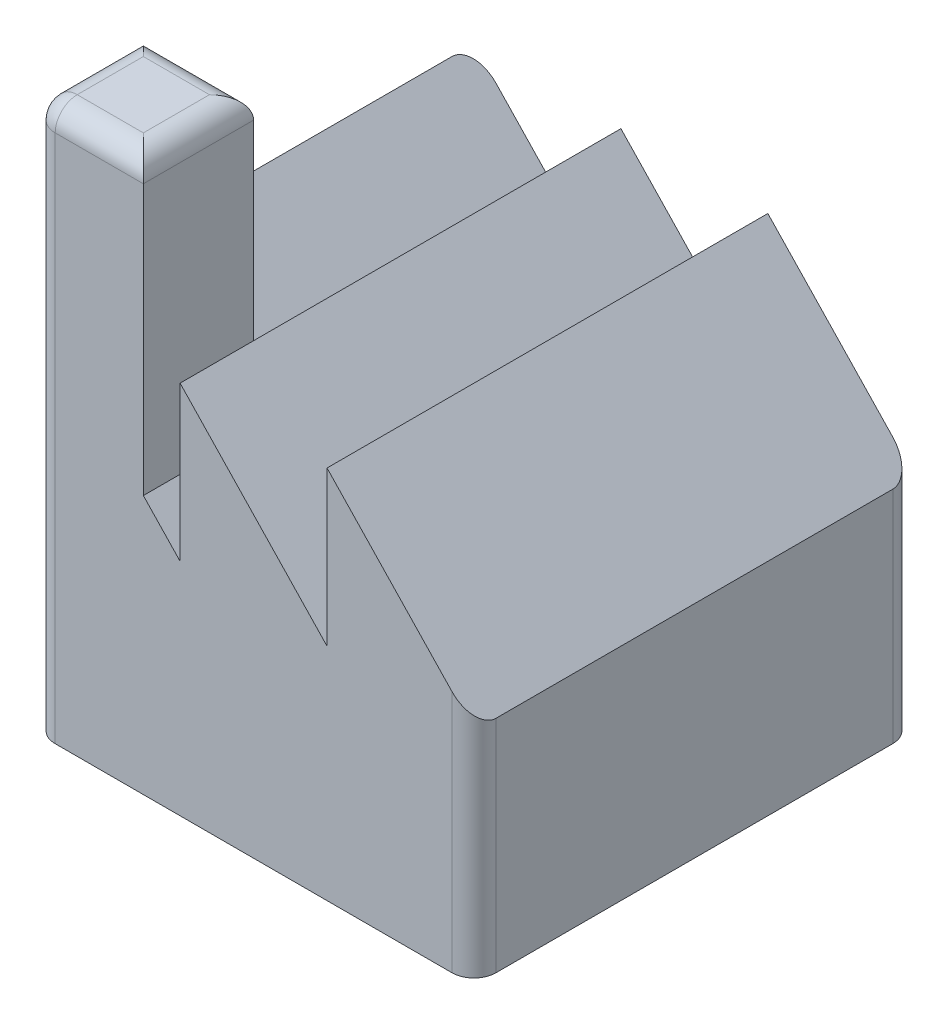
ISO-10303-21;
HEADER;
FILE_DESCRIPTION(('STEP AP214'),'2;1');
FILE_NAME('part.step','',(''),(''),'','','');
FILE_SCHEMA(('AUTOMOTIVE_DESIGN { 1 0 10303 214 1 1 1 1 }'));
ENDSEC;
DATA;
#1=APPLICATION_CONTEXT('core data for automotive mechanical design processes');
#2=APPLICATION_PROTOCOL_DEFINITION('international standard','automotive_design',2000,#1);
#3=PRODUCT_CONTEXT('',#1,'mechanical');
#4=PRODUCT('Part','Part','',(#3));
#5=PRODUCT_RELATED_PRODUCT_CATEGORY('part','',(#4));
#6=PRODUCT_DEFINITION_FORMATION('','',#4);
#7=PRODUCT_DEFINITION_CONTEXT('part definition',#1,'design');
#8=PRODUCT_DEFINITION('design','',#6,#7);
#9=PRODUCT_DEFINITION_SHAPE('','',#8);
#10=(LENGTH_UNIT() NAMED_UNIT(*) SI_UNIT(.MILLI.,.METRE.));
#11=(NAMED_UNIT(*) PLANE_ANGLE_UNIT() SI_UNIT($,.RADIAN.));
#12=(NAMED_UNIT(*) SI_UNIT($,.STERADIAN.) SOLID_ANGLE_UNIT());
#13=UNCERTAINTY_MEASURE_WITH_UNIT(LENGTH_MEASURE(1.E-05),#10,'distance_accuracy_value','');
#14=(GEOMETRIC_REPRESENTATION_CONTEXT(3) GLOBAL_UNCERTAINTY_ASSIGNED_CONTEXT((#13)) GLOBAL_UNIT_ASSIGNED_CONTEXT((#10,
#11,#12)) REPRESENTATION_CONTEXT('',''));
#15=CARTESIAN_POINT('',(0.,0.,0.));
#16=DIRECTION('',(0.,0.,1.));
#17=DIRECTION('',(1.,0.,0.));
#18=AXIS2_PLACEMENT_3D('',#15,#16,#17);
#19=CARTESIAN_POINT('',(3.33333333333333,12.,20.));
#20=DIRECTION('',(-0.724137931034483,-0.689655172413793,0.));
#21=DIRECTION('',(0.689655172413793,-0.724137931034483,0.));
#22=AXIS2_PLACEMENT_3D('',#19,#20,#21);
#23=PLANE('',#22);
#24=DIRECTION('',(-0.689655172413793,0.724137931034483,0.));
#25=VECTOR('',#24,1.);
#26=CARTESIAN_POINT('',(3.33333333333333,12.,20.));
#27=LINE('',#26,#25);
#28=CARTESIAN_POINT('',(8.99999999999999,6.05,20.));
#29=VERTEX_POINT('',#28);
#30=CARTESIAN_POINT('',(3.33333333333333,12.,20.));
#31=VERTEX_POINT('',#30);
#32=EDGE_CURVE('E206',#29,#31,#27,.T.);
#33=ORIENTED_EDGE('',*,*,#32,.F.);
#34=CARTESIAN_POINT('',(9.,6.05,19.));
#35=DIRECTION('',(-0.724137931034483,-0.689655172413793,0.));
#36=DIRECTION('',(0.689655172413793,-0.724137931034483,0.));
#37=AXIS2_PLACEMENT_3D('',#34,#35,#36);
#38=ELLIPSE('',#37,1.45,1.);
#39=CARTESIAN_POINT('',(10.,5.,19.));
#40=VERTEX_POINT('',#39);
#41=EDGE_CURVE('E60',#29,#40,#38,.F.);
#42=ORIENTED_EDGE('',*,*,#41,.T.);
#43=DIRECTION('',(0.,0.,-1.));
#44=VECTOR('',#43,1.);
#45=CARTESIAN_POINT('',(10.,5.,20.));
#46=LINE('',#45,#44);
#47=CARTESIAN_POINT('',(10.,5.,1.));
#48=VERTEX_POINT('',#47);
#49=EDGE_CURVE('E187',#40,#48,#46,.T.);
#50=ORIENTED_EDGE('',*,*,#49,.T.);
#51=CARTESIAN_POINT('',(9.,6.05,1.));
#52=DIRECTION('',(-0.724137931034483,-0.689655172413793,0.));
#53=DIRECTION('',(-0.689655172413793,0.724137931034483,0.));
#54=AXIS2_PLACEMENT_3D('',#51,#52,#53);
#55=ELLIPSE('',#54,1.45,1.);
#56=CARTESIAN_POINT('',(8.99999999999999,6.05,0.));
#57=VERTEX_POINT('',#56);
#58=EDGE_CURVE('E52',#48,#57,#55,.F.);
#59=ORIENTED_EDGE('',*,*,#58,.T.);
#60=DIRECTION('',(-0.689655172413793,0.724137931034483,0.));
#61=VECTOR('',#60,1.);
#62=CARTESIAN_POINT('',(3.33333333333333,12.,0.));
#63=LINE('',#62,#61);
#64=CARTESIAN_POINT('',(3.33333333333333,12.,0.));
#65=VERTEX_POINT('',#64);
#66=EDGE_CURVE('E193',#57,#65,#63,.T.);
#67=ORIENTED_EDGE('',*,*,#66,.T.);
#68=DIRECTION('',(0.,0.,-1.));
#69=VECTOR('',#68,1.);
#70=CARTESIAN_POINT('',(3.33333333333333,12.,20.));
#71=LINE('',#70,#69);
#72=EDGE_CURVE('E225',#31,#65,#71,.T.);
#73=ORIENTED_EDGE('',*,*,#72,.F.);
#74=EDGE_LOOP('',(#33,#42,#50,#59,#67,#73));
#75=FACE_BOUND('',#74,.T.);
#76=ADVANCED_FACE('F35',(#75),#23,.F.);
#77=CARTESIAN_POINT('',(3.33333333333333,5.,20.));
#78=DIRECTION('',(1.,0.,0.));
#79=DIRECTION('',(0.,0.,-1.));
#80=AXIS2_PLACEMENT_3D('',#77,#78,#79);
#81=PLANE('',#80);
#82=DIRECTION('',(0.,-1.,0.));
#83=VECTOR('',#82,1.);
#84=CARTESIAN_POINT('',(3.33333333333333,5.,0.));
#85=LINE('',#84,#83);
#86=CARTESIAN_POINT('',(3.33333333333333,5.,0.));
#87=VERTEX_POINT('',#86);
#88=EDGE_CURVE('E195',#65,#87,#85,.T.);
#89=ORIENTED_EDGE('',*,*,#88,.T.);
#90=DIRECTION('',(0.,0.,-1.));
#91=VECTOR('',#90,1.);
#92=CARTESIAN_POINT('',(3.33333333333333,5.,20.));
#93=LINE('',#92,#91);
#94=CARTESIAN_POINT('',(3.33333333333333,5.,20.));
#95=VERTEX_POINT('',#94);
#96=EDGE_CURVE('E222',#95,#87,#93,.T.);
#97=ORIENTED_EDGE('',*,*,#96,.F.);
#98=DIRECTION('',(0.,-1.,0.));
#99=VECTOR('',#98,1.);
#100=CARTESIAN_POINT('',(3.33333333333333,5.,20.));
#101=LINE('',#100,#99);
#102=EDGE_CURVE('E298',#31,#95,#101,.T.);
#103=ORIENTED_EDGE('',*,*,#102,.F.);
#104=ORIENTED_EDGE('',*,*,#72,.T.);
#105=EDGE_LOOP('',(#89,#97,#103,#104));
#106=FACE_BOUND('',#105,.T.);
#107=ADVANCED_FACE('F358',(#106),#81,.F.);
#108=CARTESIAN_POINT('',(-3.33333333333334,12.,20.));
#109=DIRECTION('',(-0.724137931034483,-0.689655172413793,0.));
#110=DIRECTION('',(0.689655172413793,-0.724137931034483,0.));
#111=AXIS2_PLACEMENT_3D('',#108,#109,#110);
#112=PLANE('',#111);
#113=DIRECTION('',(-0.689655172413793,0.724137931034483,0.));
#114=VECTOR('',#113,1.);
#115=CARTESIAN_POINT('',(-3.33333333333334,12.,0.));
#116=LINE('',#115,#114);
#117=CARTESIAN_POINT('',(-3.33333333333334,12.,0.));
#118=VERTEX_POINT('',#117);
#119=EDGE_CURVE('E197',#87,#118,#116,.T.);
#120=ORIENTED_EDGE('',*,*,#119,.T.);
#121=DIRECTION('',(0.,0.,-1.));
#122=VECTOR('',#121,1.);
#123=CARTESIAN_POINT('',(-3.33333333333334,12.,20.));
#124=LINE('',#123,#122);
#125=CARTESIAN_POINT('',(-3.33333333333334,12.,20.));
#126=VERTEX_POINT('',#125);
#127=EDGE_CURVE('E219',#126,#118,#124,.T.);
#128=ORIENTED_EDGE('',*,*,#127,.F.);
#129=DIRECTION('',(-0.689655172413793,0.724137931034483,0.));
#130=VECTOR('',#129,1.);
#131=CARTESIAN_POINT('',(-3.33333333333334,12.,20.));
#132=LINE('',#131,#130);
#133=EDGE_CURVE('E189',#95,#126,#132,.T.);
#134=ORIENTED_EDGE('',*,*,#133,.F.);
#135=ORIENTED_EDGE('',*,*,#96,.T.);
#136=EDGE_LOOP('',(#120,#128,#134,#135));
#137=FACE_BOUND('',#136,.T.);
#138=ADVANCED_FACE('F304',(#137),#112,.F.);
#139=CARTESIAN_POINT('',(-3.33333333333334,5.,20.));
#140=DIRECTION('',(1.,0.,0.));
#141=DIRECTION('',(0.,0.,-1.));
#142=AXIS2_PLACEMENT_3D('',#139,#140,#141);
#143=PLANE('',#142);
#144=DIRECTION('',(0.,-1.,0.));
#145=VECTOR('',#144,1.);
#146=CARTESIAN_POINT('',(-3.33333333333334,5.,0.));
#147=LINE('',#146,#145);
#148=CARTESIAN_POINT('',(-3.33333333333334,5.,0.));
#149=VERTEX_POINT('',#148);
#150=EDGE_CURVE('E199',#118,#149,#147,.T.);
#151=ORIENTED_EDGE('',*,*,#150,.T.);
#152=DIRECTION('',(0.,0.,-1.));
#153=VECTOR('',#152,1.);
#154=CARTESIAN_POINT('',(-3.33333333333334,5.,20.));
#155=LINE('',#154,#153);
#156=CARTESIAN_POINT('',(-3.33333333333334,5.,20.));
#157=VERTEX_POINT('',#156);
#158=EDGE_CURVE('E217',#157,#149,#155,.T.);
#159=ORIENTED_EDGE('',*,*,#158,.F.);
#160=DIRECTION('',(0.,-1.,0.));
#161=VECTOR('',#160,1.);
#162=CARTESIAN_POINT('',(-3.33333333333334,5.,20.));
#163=LINE('',#162,#161);
#164=EDGE_CURVE('E182',#126,#157,#163,.T.);
#165=ORIENTED_EDGE('',*,*,#164,.F.);
#166=ORIENTED_EDGE('',*,*,#127,.T.);
#167=EDGE_LOOP('',(#151,#159,#165,#166));
#168=FACE_BOUND('',#167,.T.);
#169=ADVANCED_FACE('F308',(#168),#143,.F.);
#170=CARTESIAN_POINT('',(-10.,12.,20.));
#171=DIRECTION('',(-0.724137931034483,-0.689655172413793,0.));
#172=DIRECTION('',(0.689655172413793,-0.724137931034483,0.));
#173=AXIS2_PLACEMENT_3D('',#170,#171,#172);
#174=PLANE('',#173);
#175=DIRECTION('',(-0.689655172413793,0.724137931034483,0.));
#176=VECTOR('',#175,1.);
#177=CARTESIAN_POINT('',(-10.,12.,0.));
#178=LINE('',#177,#176);
#179=CARTESIAN_POINT('',(-9.00000000000001,10.95,0.));
#180=VERTEX_POINT('',#179);
#181=EDGE_CURVE('E201',#149,#180,#178,.T.);
#182=ORIENTED_EDGE('',*,*,#181,.T.);
#183=CARTESIAN_POINT('',(-9.00000000000001,10.95,1.));
#184=DIRECTION('',(-0.724137931034483,-0.689655172413793,0.));
#185=DIRECTION('',(0.689655172413793,-0.724137931034483,0.));
#186=AXIS2_PLACEMENT_3D('',#183,#184,#185);
#187=ELLIPSE('',#186,1.45,1.);
#188=CARTESIAN_POINT('',(-10.,12.,1.));
#189=VERTEX_POINT('',#188);
#190=EDGE_CURVE('E267',#180,#189,#187,.F.);
#191=ORIENTED_EDGE('',*,*,#190,.T.);
#192=DIRECTION('',(0.,0.,-1.));
#193=VECTOR('',#192,1.);
#194=CARTESIAN_POINT('',(-10.,12.,20.));
#195=LINE('',#194,#193);
#196=CARTESIAN_POINT('',(-10.,12.,15.));
#197=VERTEX_POINT('',#196);
#198=EDGE_CURVE('E214',#197,#189,#195,.T.);
#199=ORIENTED_EDGE('',*,*,#198,.F.);
#200=DIRECTION('',(0.689655172413793,-0.724137931034483,0.));
#201=VECTOR('',#200,1.);
#202=CARTESIAN_POINT('',(-10.,12.,15.));
#203=LINE('',#202,#201);
#204=CARTESIAN_POINT('',(-5.,6.75,15.));
#205=VERTEX_POINT('',#204);
#206=EDGE_CURVE('E178',#197,#205,#203,.T.);
#207=ORIENTED_EDGE('',*,*,#206,.T.);
#208=DIRECTION('',(0.,0.,1.));
#209=VECTOR('',#208,1.);
#210=CARTESIAN_POINT('',(-5.,6.75,20.));
#211=LINE('',#210,#209);
#212=CARTESIAN_POINT('',(-5.,6.75,20.));
#213=VERTEX_POINT('',#212);
#214=EDGE_CURVE('E161',#205,#213,#211,.T.);
#215=ORIENTED_EDGE('',*,*,#214,.T.);
#216=DIRECTION('',(-0.689655172413793,0.724137931034483,0.));
#217=VECTOR('',#216,1.);
#218=CARTESIAN_POINT('',(-10.,12.,20.));
#219=LINE('',#218,#217);
#220=EDGE_CURVE('E175',#157,#213,#219,.T.);
#221=ORIENTED_EDGE('',*,*,#220,.F.);
#222=ORIENTED_EDGE('',*,*,#158,.T.);
#223=EDGE_LOOP('',(#182,#191,#199,#207,#215,#221,#222));
#224=FACE_BOUND('',#223,.T.);
#225=ADVANCED_FACE('F173',(#224),#174,.F.);
#226=CARTESIAN_POINT('',(-10.,-5.,20.));
#227=DIRECTION('',(1.,0.,0.));
#228=DIRECTION('',(0.,0.,-1.));
#229=AXIS2_PLACEMENT_3D('',#226,#227,#228);
#230=PLANE('',#229);
#231=ORIENTED_EDGE('',*,*,#198,.T.);
#232=DIRECTION('',(0.,-1.,0.));
#233=VECTOR('',#232,1.);
#234=CARTESIAN_POINT('',(-10.,-5.,1.));
#235=LINE('',#234,#233);
#236=CARTESIAN_POINT('',(-10.,-5.,1.));
#237=VERTEX_POINT('',#236);
#238=EDGE_CURVE('E252',#189,#237,#235,.T.);
#239=ORIENTED_EDGE('',*,*,#238,.T.);
#240=DIRECTION('',(0.,0.,-1.));
#241=VECTOR('',#240,1.);
#242=CARTESIAN_POINT('',(-10.,-5.,20.));
#243=LINE('',#242,#241);
#244=CARTESIAN_POINT('',(-10.,-5.,19.));
#245=VERTEX_POINT('',#244);
#246=EDGE_CURVE('E211',#245,#237,#243,.T.);
#247=ORIENTED_EDGE('',*,*,#246,.F.);
#248=DIRECTION('',(0.,-1.,0.));
#249=VECTOR('',#248,1.);
#250=CARTESIAN_POINT('',(-10.,20.,19.));
#251=LINE('',#250,#249);
#252=CARTESIAN_POINT('',(-10.,19.,19.));
#253=VERTEX_POINT('',#252);
#254=EDGE_CURVE('E248',#245,#253,#251,.F.);
#255=ORIENTED_EDGE('',*,*,#254,.T.);
#256=DIRECTION('',(0.,0.,-1.));
#257=VECTOR('',#256,1.);
#258=CARTESIAN_POINT('',(-10.,19.,20.));
#259=LINE('',#258,#257);
#260=CARTESIAN_POINT('',(-10.,19.,15.));
#261=VERTEX_POINT('',#260);
#262=EDGE_CURVE('E250',#253,#261,#259,.T.);
#263=ORIENTED_EDGE('',*,*,#262,.T.);
#264=DIRECTION('',(0.,-1.,0.));
#265=VECTOR('',#264,1.);
#266=CARTESIAN_POINT('',(-10.,20.,15.));
#267=LINE('',#266,#265);
#268=EDGE_CURVE('E287',#261,#197,#267,.T.);
#269=ORIENTED_EDGE('',*,*,#268,.T.);
#270=EDGE_LOOP('',(#231,#239,#247,#255,#263,#269));
#271=FACE_BOUND('',#270,.T.);
#272=ADVANCED_FACE('F318',(#271),#230,.F.);
#273=CARTESIAN_POINT('',(-10.,-5.,20.));
#274=DIRECTION('',(0.,1.,0.));
#275=DIRECTION('',(0.,0.,1.));
#276=AXIS2_PLACEMENT_3D('',#273,#274,#275);
#277=PLANE('',#276);
#278=ORIENTED_EDGE('',*,*,#246,.T.);
#279=CARTESIAN_POINT('',(-9.00000000000001,-5.,1.));
#280=DIRECTION('',(0.,1.,0.));
#281=DIRECTION('',(0.,0.,1.));
#282=AXIS2_PLACEMENT_3D('',#279,#280,#281);
#283=CIRCLE('',#282,1.);
#284=CARTESIAN_POINT('',(-9.00000000000001,-5.,0.));
#285=VERTEX_POINT('',#284);
#286=EDGE_CURVE('E261',#237,#285,#283,.F.);
#287=ORIENTED_EDGE('',*,*,#286,.T.);
#288=DIRECTION('',(1.,0.,0.));
#289=VECTOR('',#288,1.);
#290=CARTESIAN_POINT('',(-10.,-5.,0.));
#291=LINE('',#290,#289);
#292=CARTESIAN_POINT('',(9.,-5.,0.));
#293=VERTEX_POINT('',#292);
#294=EDGE_CURVE('E203',#285,#293,#291,.T.);
#295=ORIENTED_EDGE('',*,*,#294,.T.);
#296=CARTESIAN_POINT('',(9.,-5.,1.));
#297=DIRECTION('',(0.,1.,0.));
#298=DIRECTION('',(0.,0.,1.));
#299=AXIS2_PLACEMENT_3D('',#296,#297,#298);
#300=CIRCLE('',#299,1.);
#301=CARTESIAN_POINT('',(10.,-5.,1.));
#302=VERTEX_POINT('',#301);
#303=EDGE_CURVE('E255',#293,#302,#300,.F.);
#304=ORIENTED_EDGE('',*,*,#303,.T.);
#305=DIRECTION('',(0.,0.,-1.));
#306=VECTOR('',#305,1.);
#307=CARTESIAN_POINT('',(10.,-5.,20.));
#308=LINE('',#307,#306);
#309=CARTESIAN_POINT('',(10.,-5.,19.));
#310=VERTEX_POINT('',#309);
#311=EDGE_CURVE('E208',#310,#302,#308,.T.);
#312=ORIENTED_EDGE('',*,*,#311,.F.);
#313=CARTESIAN_POINT('',(9.,-5.,19.));
#314=DIRECTION('',(0.,1.,0.));
#315=DIRECTION('',(0.,0.,1.));
#316=AXIS2_PLACEMENT_3D('',#313,#314,#315);
#317=CIRCLE('',#316,1.);
#318=CARTESIAN_POINT('',(9.,-5.,20.));
#319=VERTEX_POINT('',#318);
#320=EDGE_CURVE('E257',#310,#319,#317,.F.);
#321=ORIENTED_EDGE('',*,*,#320,.T.);
#322=DIRECTION('',(1.,0.,0.));
#323=VECTOR('',#322,1.);
#324=CARTESIAN_POINT('',(-10.,-5.,20.));
#325=LINE('',#324,#323);
#326=CARTESIAN_POINT('',(-9.00000000000001,-5.,20.));
#327=VERTEX_POINT('',#326);
#328=EDGE_CURVE('E184',#327,#319,#325,.T.);
#329=ORIENTED_EDGE('',*,*,#328,.F.);
#330=CARTESIAN_POINT('',(-9.00000000000001,-5.,19.));
#331=DIRECTION('',(0.,1.,0.));
#332=DIRECTION('',(0.,0.,1.));
#333=AXIS2_PLACEMENT_3D('',#330,#331,#332);
#334=CIRCLE('',#333,1.);
#335=EDGE_CURVE('E259',#327,#245,#334,.F.);
#336=ORIENTED_EDGE('',*,*,#335,.T.);
#337=EDGE_LOOP('',(#278,#287,#295,#304,#312,#321,#329,#336));
#338=FACE_BOUND('',#337,.T.);
#339=ADVANCED_FACE('F322',(#338),#277,.F.);
#340=CARTESIAN_POINT('',(10.,-5.,20.));
#341=DIRECTION('',(-1.,0.,0.));
#342=DIRECTION('',(0.,0.,1.));
#343=AXIS2_PLACEMENT_3D('',#340,#341,#342);
#344=PLANE('',#343);
#345=ORIENTED_EDGE('',*,*,#49,.F.);
#346=DIRECTION('',(0.,1.,0.));
#347=VECTOR('',#346,1.);
#348=CARTESIAN_POINT('',(10.,-5.,19.));
#349=LINE('',#348,#347);
#350=EDGE_CURVE('E11',#40,#310,#349,.F.);
#351=ORIENTED_EDGE('',*,*,#350,.T.);
#352=ORIENTED_EDGE('',*,*,#311,.T.);
#353=DIRECTION('',(0.,1.,0.));
#354=VECTOR('',#353,1.);
#355=CARTESIAN_POINT('',(10.,-5.,1.));
#356=LINE('',#355,#354);
#357=EDGE_CURVE('E44',#302,#48,#356,.T.);
#358=ORIENTED_EDGE('',*,*,#357,.T.);
#359=EDGE_LOOP('',(#345,#351,#352,#358));
#360=FACE_BOUND('',#359,.T.);
#361=ADVANCED_FACE('F352',(#360),#344,.F.);
#362=CARTESIAN_POINT('',(0.,0.,20.));
#363=DIRECTION('',(0.,0.,1.));
#364=DIRECTION('',(1.,0.,0.));
#365=AXIS2_PLACEMENT_3D('',#362,#363,#364);
#366=PLANE('',#365);
#367=DIRECTION('',(0.,-1.,0.));
#368=VECTOR('',#367,1.);
#369=CARTESIAN_POINT('',(-5.,20.,20.));
#370=LINE('',#369,#368);
#371=CARTESIAN_POINT('',(-5.,19.,20.));
#372=VERTEX_POINT('',#371);
#373=EDGE_CURVE('E157',#372,#213,#370,.T.);
#374=ORIENTED_EDGE('',*,*,#373,.F.);
#375=DIRECTION('',(-1.,0.,0.));
#376=VECTOR('',#375,1.);
#377=CARTESIAN_POINT('',(-10.,19.,20.));
#378=LINE('',#377,#376);
#379=CARTESIAN_POINT('',(-9.00000000000001,19.,20.));
#380=VERTEX_POINT('',#379);
#381=EDGE_CURVE('E246',#372,#380,#378,.T.);
#382=ORIENTED_EDGE('',*,*,#381,.T.);
#383=DIRECTION('',(0.,-1.,0.));
#384=VECTOR('',#383,1.);
#385=CARTESIAN_POINT('',(-9.00000000000001,-5.,20.));
#386=LINE('',#385,#384);
#387=EDGE_CURVE('E244',#380,#327,#386,.T.);
#388=ORIENTED_EDGE('',*,*,#387,.T.);
#389=ORIENTED_EDGE('',*,*,#328,.T.);
#390=DIRECTION('',(0.,1.,0.));
#391=VECTOR('',#390,1.);
#392=CARTESIAN_POINT('',(9.,5.,20.));
#393=LINE('',#392,#391);
#394=EDGE_CURVE('E241',#319,#29,#393,.T.);
#395=ORIENTED_EDGE('',*,*,#394,.T.);
#396=ORIENTED_EDGE('',*,*,#32,.T.);
#397=ORIENTED_EDGE('',*,*,#102,.T.);
#398=ORIENTED_EDGE('',*,*,#133,.T.);
#399=ORIENTED_EDGE('',*,*,#164,.T.);
#400=ORIENTED_EDGE('',*,*,#220,.T.);
#401=EDGE_LOOP('',(#374,#382,#388,#389,#395,#396,#397,#398,#399,#400));
#402=FACE_BOUND('',#401,.T.);
#403=ADVANCED_FACE('F180',(#402),#366,.T.);
#404=CARTESIAN_POINT('',(0.,0.,0.));
#405=DIRECTION('',(0.,0.,1.));
#406=DIRECTION('',(1.,0.,0.));
#407=AXIS2_PLACEMENT_3D('',#404,#405,#406);
#408=PLANE('',#407);
#409=ORIENTED_EDGE('',*,*,#294,.F.);
#410=DIRECTION('',(0.,-1.,0.));
#411=VECTOR('',#410,1.);
#412=CARTESIAN_POINT('',(-9.00000000000001,0.,0.));
#413=LINE('',#412,#411);
#414=EDGE_CURVE('E265',#285,#180,#413,.F.);
#415=ORIENTED_EDGE('',*,*,#414,.T.);
#416=ORIENTED_EDGE('',*,*,#181,.F.);
#417=ORIENTED_EDGE('',*,*,#150,.F.);
#418=ORIENTED_EDGE('',*,*,#119,.F.);
#419=ORIENTED_EDGE('',*,*,#88,.F.);
#420=ORIENTED_EDGE('',*,*,#66,.F.);
#421=DIRECTION('',(0.,1.,0.));
#422=VECTOR('',#421,1.);
#423=CARTESIAN_POINT('',(9.,0.,0.));
#424=LINE('',#423,#422);
#425=EDGE_CURVE('E263',#57,#293,#424,.F.);
#426=ORIENTED_EDGE('',*,*,#425,.T.);
#427=EDGE_LOOP('',(#409,#415,#416,#417,#418,#419,#420,#426));
#428=FACE_BOUND('',#427,.T.);
#429=ADVANCED_FACE('F313',(#428),#408,.F.);
#430=CARTESIAN_POINT('',(-10.,20.,15.));
#431=DIRECTION('',(0.,0.,-1.));
#432=DIRECTION('',(-1.,0.,0.));
#433=AXIS2_PLACEMENT_3D('',#430,#431,#432);
#434=PLANE('',#433);
#435=ORIENTED_EDGE('',*,*,#268,.F.);
#436=DIRECTION('',(1.,0.,0.));
#437=VECTOR('',#436,1.);
#438=CARTESIAN_POINT('',(-5.,19.,15.));
#439=LINE('',#438,#437);
#440=CARTESIAN_POINT('',(-5.,19.,15.));
#441=VERTEX_POINT('',#440);
#442=EDGE_CURVE('E228',#261,#441,#439,.T.);
#443=ORIENTED_EDGE('',*,*,#442,.T.);
#444=DIRECTION('',(0.,-1.,0.));
#445=VECTOR('',#444,1.);
#446=CARTESIAN_POINT('',(-5.,20.,15.));
#447=LINE('',#446,#445);
#448=EDGE_CURVE('E168',#441,#205,#447,.T.);
#449=ORIENTED_EDGE('',*,*,#448,.T.);
#450=ORIENTED_EDGE('',*,*,#206,.F.);
#451=EDGE_LOOP('',(#435,#443,#449,#450));
#452=FACE_BOUND('',#451,.T.);
#453=ADVANCED_FACE('F332',(#452),#434,.T.);
#454=CARTESIAN_POINT('',(-5.,20.,20.));
#455=DIRECTION('',(1.,0.,0.));
#456=DIRECTION('',(0.,0.,-1.));
#457=AXIS2_PLACEMENT_3D('',#454,#455,#456);
#458=PLANE('',#457);
#459=ORIENTED_EDGE('',*,*,#448,.F.);
#460=DIRECTION('',(0.,0.,1.));
#461=VECTOR('',#460,1.);
#462=CARTESIAN_POINT('',(-5.,19.,20.));
#463=LINE('',#462,#461);
#464=EDGE_CURVE('E164',#441,#372,#463,.T.);
#465=ORIENTED_EDGE('',*,*,#464,.T.);
#466=ORIENTED_EDGE('',*,*,#373,.T.);
#467=ORIENTED_EDGE('',*,*,#214,.F.);
#468=EDGE_LOOP('',(#459,#465,#466,#467));
#469=FACE_BOUND('',#468,.T.);
#470=ADVANCED_FACE('F160',(#469),#458,.T.);
#471=CARTESIAN_POINT('',(0.,20.,0.));
#472=DIRECTION('',(0.,-1.,0.));
#473=DIRECTION('',(0.,0.,-1.));
#474=AXIS2_PLACEMENT_3D('',#471,#472,#473);
#475=PLANE('',#474);
#476=DIRECTION('',(0.,0.,1.));
#477=VECTOR('',#476,1.);
#478=CARTESIAN_POINT('',(-6.,20.,15.));
#479=LINE('',#478,#477);
#480=CARTESIAN_POINT('',(-6.,20.,19.));
#481=VERTEX_POINT('',#480);
#482=CARTESIAN_POINT('',(-6.,20.,16.));
#483=VERTEX_POINT('',#482);
#484=EDGE_CURVE('E235',#481,#483,#479,.F.);
#485=ORIENTED_EDGE('',*,*,#484,.T.);
#486=DIRECTION('',(1.,0.,0.));
#487=VECTOR('',#486,1.);
#488=CARTESIAN_POINT('',(-10.,20.,16.));
#489=LINE('',#488,#487);
#490=CARTESIAN_POINT('',(-9.00000000000001,20.,16.));
#491=VERTEX_POINT('',#490);
#492=EDGE_CURVE('E237',#483,#491,#489,.F.);
#493=ORIENTED_EDGE('',*,*,#492,.T.);
#494=DIRECTION('',(0.,0.,-1.));
#495=VECTOR('',#494,1.);
#496=CARTESIAN_POINT('',(-9.00000000000001,20.,0.));
#497=LINE('',#496,#495);
#498=CARTESIAN_POINT('',(-9.00000000000001,20.,19.));
#499=VERTEX_POINT('',#498);
#500=EDGE_CURVE('E231',#491,#499,#497,.F.);
#501=ORIENTED_EDGE('',*,*,#500,.T.);
#502=DIRECTION('',(-1.,0.,0.));
#503=VECTOR('',#502,1.);
#504=CARTESIAN_POINT('',(-5.,20.,19.));
#505=LINE('',#504,#503);
#506=EDGE_CURVE('E233',#499,#481,#505,.F.);
#507=ORIENTED_EDGE('',*,*,#506,.T.);
#508=EDGE_LOOP('',(#485,#493,#501,#507));
#509=FACE_BOUND('',#508,.T.);
#510=ADVANCED_FACE('F382',(#509),#475,.F.);
#511=CARTESIAN_POINT('',(-9.00000000000001,0.,19.));
#512=DIRECTION('',(0.,1.,0.));
#513=DIRECTION('',(0.,0.,1.));
#514=AXIS2_PLACEMENT_3D('',#511,#512,#513);
#515=CYLINDRICAL_SURFACE('',#514,1.);
#516=CARTESIAN_POINT('',(-9.00000000000001,19.,19.));
#517=DIRECTION('',(0.,1.,0.));
#518=DIRECTION('',(0.,0.,1.));
#519=AXIS2_PLACEMENT_3D('',#516,#517,#518);
#520=CIRCLE('',#519,1.);
#521=EDGE_CURVE('E39',#253,#380,#520,.T.);
#522=ORIENTED_EDGE('',*,*,#521,.F.);
#523=ORIENTED_EDGE('',*,*,#254,.F.);
#524=ORIENTED_EDGE('',*,*,#335,.F.);
#525=ORIENTED_EDGE('',*,*,#387,.F.);
#526=EDGE_LOOP('',(#522,#523,#524,#525));
#527=FACE_BOUND('',#526,.T.);
#528=ADVANCED_FACE('F327',(#527),#515,.T.);
#529=CARTESIAN_POINT('',(-9.00000000000001,19.,19.));
#530=DIRECTION('',(0.,0.,1.));
#531=DIRECTION('',(1.,0.,0.));
#532=AXIS2_PLACEMENT_3D('',#529,#530,#531);
#533=SPHERICAL_SURFACE('',#532,1.);
#534=CARTESIAN_POINT('',(-9.00000000000001,19.,19.));
#535=DIRECTION('',(0.,0.,1.));
#536=DIRECTION('',(1.,0.,0.));
#537=AXIS2_PLACEMENT_3D('',#534,#535,#536);
#538=CIRCLE('',#537,1.);
#539=EDGE_CURVE('E279',#253,#499,#538,.F.);
#540=ORIENTED_EDGE('',*,*,#539,.F.);
#541=ORIENTED_EDGE('',*,*,#521,.T.);
#542=CARTESIAN_POINT('',(-9.00000000000001,19.,19.));
#543=DIRECTION('',(-1.,0.,0.));
#544=DIRECTION('',(0.,0.,1.));
#545=AXIS2_PLACEMENT_3D('',#542,#543,#544);
#546=CIRCLE('',#545,1.);
#547=EDGE_CURVE('E281',#499,#380,#546,.F.);
#548=ORIENTED_EDGE('',*,*,#547,.F.);
#549=EDGE_LOOP('',(#540,#541,#548));
#550=FACE_BOUND('',#549,.T.);
#551=ADVANCED_FACE('F377',(#550),#533,.T.);
#552=CARTESIAN_POINT('',(0.,19.,19.));
#553=DIRECTION('',(1.,0.,0.));
#554=DIRECTION('',(0.,0.,-1.));
#555=AXIS2_PLACEMENT_3D('',#552,#553,#554);
#556=CYLINDRICAL_SURFACE('',#555,1.);
#557=ORIENTED_EDGE('',*,*,#547,.T.);
#558=ORIENTED_EDGE('',*,*,#381,.F.);
#559=CARTESIAN_POINT('',(-6.,19.,19.));
#560=DIRECTION('',(0.707106781186547,0.,-0.707106781186547));
#561=DIRECTION('',(0.707106781186547,0.,0.707106781186547));
#562=AXIS2_PLACEMENT_3D('',#559,#560,#561);
#563=ELLIPSE('',#562,1.41421356237309,1.);
#564=EDGE_CURVE('E276',#481,#372,#563,.T.);
#565=ORIENTED_EDGE('',*,*,#564,.F.);
#566=ORIENTED_EDGE('',*,*,#506,.F.);
#567=EDGE_LOOP('',(#557,#558,#565,#566));
#568=FACE_BOUND('',#567,.T.);
#569=ADVANCED_FACE('F344',(#568),#556,.T.);
#570=CARTESIAN_POINT('',(-9.00000000000001,19.,20.));
#571=DIRECTION('',(0.,0.,-1.));
#572=DIRECTION('',(-1.,0.,0.));
#573=AXIS2_PLACEMENT_3D('',#570,#571,#572);
#574=CYLINDRICAL_SURFACE('',#573,1.);
#575=ORIENTED_EDGE('',*,*,#539,.T.);
#576=ORIENTED_EDGE('',*,*,#500,.F.);
#577=CARTESIAN_POINT('',(-9.00000000000001,19.,16.));
#578=DIRECTION('',(0.707106781186547,0.,-0.707106781186547));
#579=DIRECTION('',(-0.707106781186547,0.,-0.707106781186547));
#580=AXIS2_PLACEMENT_3D('',#577,#578,#579);
#581=ELLIPSE('',#580,1.41421356237309,1.);
#582=EDGE_CURVE('E274',#261,#491,#581,.T.);
#583=ORIENTED_EDGE('',*,*,#582,.F.);
#584=ORIENTED_EDGE('',*,*,#262,.F.);
#585=EDGE_LOOP('',(#575,#576,#583,#584));
#586=FACE_BOUND('',#585,.T.);
#587=ADVANCED_FACE('F335',(#586),#574,.T.);
#588=CARTESIAN_POINT('',(-6.,19.,20.));
#589=DIRECTION('',(0.,0.,-1.));
#590=DIRECTION('',(-1.,0.,0.));
#591=AXIS2_PLACEMENT_3D('',#588,#589,#590);
#592=CYLINDRICAL_SURFACE('',#591,1.);
#593=ORIENTED_EDGE('',*,*,#564,.T.);
#594=ORIENTED_EDGE('',*,*,#464,.F.);
#595=CARTESIAN_POINT('',(-6.,19.,16.));
#596=DIRECTION('',(-0.707106781186547,0.,-0.707106781186547));
#597=DIRECTION('',(0.707106781186547,0.,-0.707106781186547));
#598=AXIS2_PLACEMENT_3D('',#595,#596,#597);
#599=ELLIPSE('',#598,1.41421356237309,1.);
#600=EDGE_CURVE('E272',#483,#441,#599,.T.);
#601=ORIENTED_EDGE('',*,*,#600,.F.);
#602=ORIENTED_EDGE('',*,*,#484,.F.);
#603=EDGE_LOOP('',(#593,#594,#601,#602));
#604=FACE_BOUND('',#603,.T.);
#605=ADVANCED_FACE('F342',(#604),#592,.T.);
#606=CARTESIAN_POINT('',(-10.,19.,16.));
#607=DIRECTION('',(-1.,0.,0.));
#608=DIRECTION('',(0.,0.,1.));
#609=AXIS2_PLACEMENT_3D('',#606,#607,#608);
#610=CYLINDRICAL_SURFACE('',#609,1.);
#611=ORIENTED_EDGE('',*,*,#582,.T.);
#612=ORIENTED_EDGE('',*,*,#492,.F.);
#613=ORIENTED_EDGE('',*,*,#600,.T.);
#614=ORIENTED_EDGE('',*,*,#442,.F.);
#615=EDGE_LOOP('',(#611,#612,#613,#614));
#616=FACE_BOUND('',#615,.T.);
#617=ADVANCED_FACE('F338',(#616),#610,.T.);
#618=CARTESIAN_POINT('',(-9.00000000000001,-5.,1.));
#619=DIRECTION('',(0.,-1.,0.));
#620=DIRECTION('',(0.,0.,-1.));
#621=AXIS2_PLACEMENT_3D('',#618,#619,#620);
#622=CYLINDRICAL_SURFACE('',#621,1.);
#623=ORIENTED_EDGE('',*,*,#190,.F.);
#624=ORIENTED_EDGE('',*,*,#414,.F.);
#625=ORIENTED_EDGE('',*,*,#286,.F.);
#626=ORIENTED_EDGE('',*,*,#238,.F.);
#627=EDGE_LOOP('',(#623,#624,#625,#626));
#628=FACE_BOUND('',#627,.T.);
#629=ADVANCED_FACE('F316',(#628),#622,.T.);
#630=CARTESIAN_POINT('',(9.,0.,19.));
#631=DIRECTION('',(0.,-1.,0.));
#632=DIRECTION('',(0.,0.,-1.));
#633=AXIS2_PLACEMENT_3D('',#630,#631,#632);
#634=CYLINDRICAL_SURFACE('',#633,1.);
#635=ORIENTED_EDGE('',*,*,#320,.F.);
#636=ORIENTED_EDGE('',*,*,#350,.F.);
#637=ORIENTED_EDGE('',*,*,#41,.F.);
#638=ORIENTED_EDGE('',*,*,#394,.F.);
#639=EDGE_LOOP('',(#635,#636,#637,#638));
#640=FACE_BOUND('',#639,.T.);
#641=ADVANCED_FACE('F348',(#640),#634,.T.);
#642=CARTESIAN_POINT('',(9.,-5.,1.));
#643=DIRECTION('',(0.,1.,0.));
#644=DIRECTION('',(0.,0.,1.));
#645=AXIS2_PLACEMENT_3D('',#642,#643,#644);
#646=CYLINDRICAL_SURFACE('',#645,1.);
#647=ORIENTED_EDGE('',*,*,#303,.F.);
#648=ORIENTED_EDGE('',*,*,#425,.F.);
#649=ORIENTED_EDGE('',*,*,#58,.F.);
#650=ORIENTED_EDGE('',*,*,#357,.F.);
#651=EDGE_LOOP('',(#647,#648,#649,#650));
#652=FACE_BOUND('',#651,.T.);
#653=ADVANCED_FACE('F37',(#652),#646,.T.);
#654=CLOSED_SHELL('',(#76,#107,#138,#169,#225,#272,#339,#361,#403,#429,#453,#470,#510,#528,#551,
#569,#587,#605,#617,#629,#641,#653));
#655=MANIFOLD_SOLID_BREP('B2',#654);
#656=ADVANCED_BREP_SHAPE_REPRESENTATION('',(#18,#655),#14);
#657=SHAPE_DEFINITION_REPRESENTATION(#9,#656);
ENDSEC;
END-ISO-10303-21;
